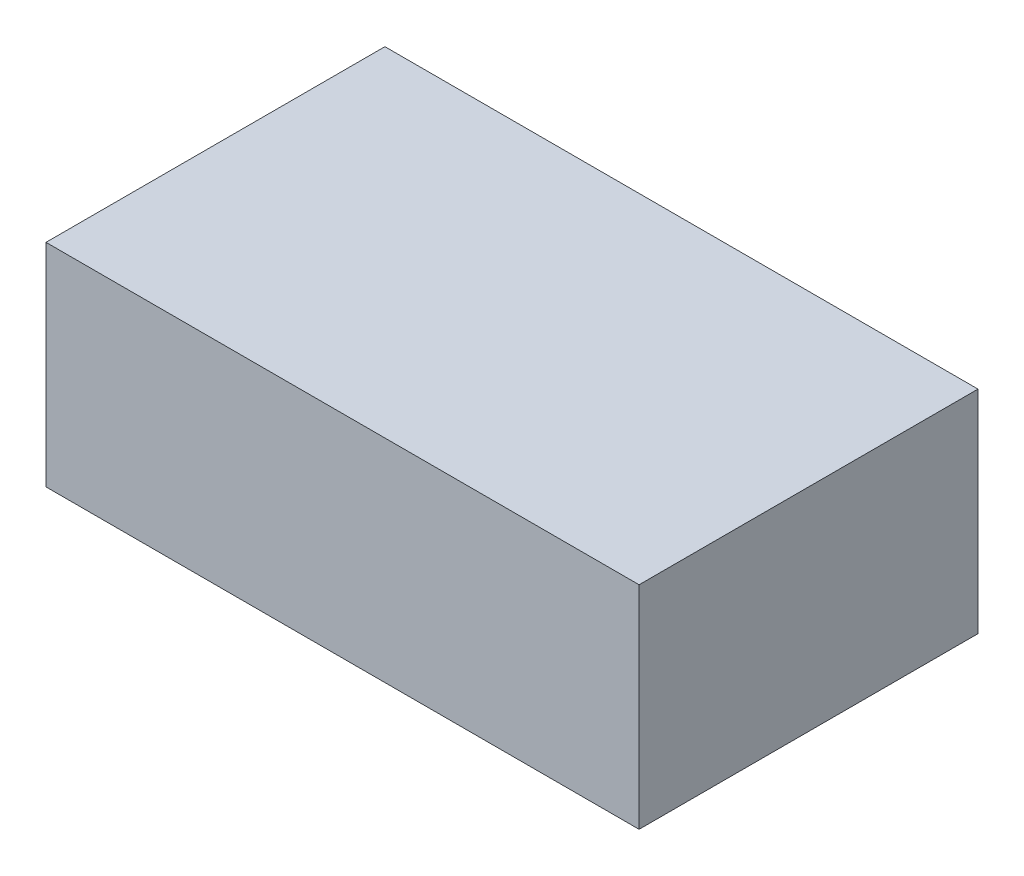
ISO-10303-21;
HEADER;
FILE_DESCRIPTION(('STEP AP214'),'2;1');
FILE_NAME('part.step','',(''),(''),'','','');
FILE_SCHEMA(('AUTOMOTIVE_DESIGN { 1 0 10303 214 1 1 1 1 }'));
ENDSEC;
DATA;
#1=APPLICATION_CONTEXT('core data for automotive mechanical design processes');
#2=APPLICATION_PROTOCOL_DEFINITION('international standard','automotive_design',2000,#1);
#3=PRODUCT_CONTEXT('',#1,'mechanical');
#4=PRODUCT('Part','Part','',(#3));
#5=PRODUCT_RELATED_PRODUCT_CATEGORY('part','',(#4));
#6=PRODUCT_DEFINITION_FORMATION('','',#4);
#7=PRODUCT_DEFINITION_CONTEXT('part definition',#1,'design');
#8=PRODUCT_DEFINITION('design','',#6,#7);
#9=PRODUCT_DEFINITION_SHAPE('','',#8);
#10=(LENGTH_UNIT() NAMED_UNIT(*) SI_UNIT(.MILLI.,.METRE.));
#11=(NAMED_UNIT(*) PLANE_ANGLE_UNIT() SI_UNIT($,.RADIAN.));
#12=(NAMED_UNIT(*) SI_UNIT($,.STERADIAN.) SOLID_ANGLE_UNIT());
#13=UNCERTAINTY_MEASURE_WITH_UNIT(LENGTH_MEASURE(1.E-05),#10,'distance_accuracy_value','');
#14=(GEOMETRIC_REPRESENTATION_CONTEXT(3) GLOBAL_UNCERTAINTY_ASSIGNED_CONTEXT((#13)) GLOBAL_UNIT_ASSIGNED_CONTEXT((#10,
#11,#12)) REPRESENTATION_CONTEXT('',''));
#15=CARTESIAN_POINT('',(0.,0.,0.));
#16=DIRECTION('',(0.,0.,1.));
#17=DIRECTION('',(1.,0.,0.));
#18=AXIS2_PLACEMENT_3D('',#15,#16,#17);
#19=CARTESIAN_POINT('',(-99.93265993266,30.8922558922559,80.));
#20=DIRECTION('',(1.,0.,0.));
#21=DIRECTION('',(0.,0.,-1.));
#22=AXIS2_PLACEMENT_3D('',#19,#20,#21);
#23=PLANE('',#22);
#24=DIRECTION('',(0.,-1.,0.));
#25=VECTOR('',#24,1.);
#26=CARTESIAN_POINT('',(-99.93265993266,30.8922558922559,0.));
#27=LINE('',#26,#25);
#28=CARTESIAN_POINT('',(-99.93265993266,30.8922558922559,0.));
#29=VERTEX_POINT('',#28);
#30=CARTESIAN_POINT('',(-99.93265993266,-19.1077441077441,0.));
#31=VERTEX_POINT('',#30);
#32=EDGE_CURVE('E241',#29,#31,#27,.T.);
#33=ORIENTED_EDGE('',*,*,#32,.T.);
#34=DIRECTION('',(0.,0.,-1.));
#35=VECTOR('',#34,1.);
#36=CARTESIAN_POINT('',(-99.93265993266,-19.1077441077441,80.));
#37=LINE('',#36,#35);
#38=CARTESIAN_POINT('',(-99.93265993266,-19.1077441077441,80.));
#39=VERTEX_POINT('',#38);
#40=EDGE_CURVE('E11',#39,#31,#37,.T.);
#41=ORIENTED_EDGE('',*,*,#40,.F.);
#42=DIRECTION('',(0.,-1.,0.));
#43=VECTOR('',#42,1.);
#44=CARTESIAN_POINT('',(-99.93265993266,30.8922558922559,80.));
#45=LINE('',#44,#43);
#46=CARTESIAN_POINT('',(-99.93265993266,30.8922558922559,80.));
#47=VERTEX_POINT('',#46);
#48=EDGE_CURVE('E248',#47,#39,#45,.T.);
#49=ORIENTED_EDGE('',*,*,#48,.F.);
#50=DIRECTION('',(0.,0.,-1.));
#51=VECTOR('',#50,1.);
#52=CARTESIAN_POINT('',(-99.93265993266,30.8922558922559,80.));
#53=LINE('',#52,#51);
#54=EDGE_CURVE('E260',#47,#29,#53,.T.);
#55=ORIENTED_EDGE('',*,*,#54,.T.);
#56=EDGE_LOOP('',(#33,#41,#49,#55));
#57=FACE_BOUND('',#56,.T.);
#58=ADVANCED_FACE('F35',(#57),#23,.F.);
#59=CARTESIAN_POINT('',(-99.93265993266,-19.1077441077441,80.));
#60=DIRECTION('',(0.,1.,0.));
#61=DIRECTION('',(-1.,0.,0.));
#62=AXIS2_PLACEMENT_3D('',#59,#60,#61);
#63=PLANE('',#62);
#64=DIRECTION('',(1.,0.,0.));
#65=VECTOR('',#64,1.);
#66=CARTESIAN_POINT('',(-99.93265993266,-19.1077441077441,0.));
#67=LINE('',#66,#65);
#68=CARTESIAN_POINT('',(40.0673400673401,-19.1077441077441,0.));
#69=VERTEX_POINT('',#68);
#70=EDGE_CURVE('E263',#31,#69,#67,.T.);
#71=ORIENTED_EDGE('',*,*,#70,.T.);
#72=DIRECTION('',(0.,0.,-1.));
#73=VECTOR('',#72,1.);
#74=CARTESIAN_POINT('',(40.0673400673401,-19.1077441077441,80.));
#75=LINE('',#74,#73);
#76=CARTESIAN_POINT('',(40.0673400673401,-19.1077441077441,80.));
#77=VERTEX_POINT('',#76);
#78=EDGE_CURVE('E42',#77,#69,#75,.T.);
#79=ORIENTED_EDGE('',*,*,#78,.F.);
#80=DIRECTION('',(1.,0.,0.));
#81=VECTOR('',#80,1.);
#82=CARTESIAN_POINT('',(-99.93265993266,-19.1077441077441,80.));
#83=LINE('',#82,#81);
#84=EDGE_CURVE('E251',#39,#77,#83,.T.);
#85=ORIENTED_EDGE('',*,*,#84,.F.);
#86=ORIENTED_EDGE('',*,*,#40,.T.);
#87=EDGE_LOOP('',(#71,#79,#85,#86));
#88=FACE_BOUND('',#87,.T.);
#89=ADVANCED_FACE('F279',(#88),#63,.F.);
#90=CARTESIAN_POINT('',(40.0673400673401,30.8922558922559,80.));
#91=DIRECTION('',(1.,0.,0.));
#92=DIRECTION('',(0.,0.,-1.));
#93=AXIS2_PLACEMENT_3D('',#90,#91,#92);
#94=PLANE('',#93);
#95=DIRECTION('',(0.,-1.,0.));
#96=VECTOR('',#95,1.);
#97=CARTESIAN_POINT('',(40.0673400673401,30.8922558922559,0.));
#98=LINE('',#97,#96);
#99=CARTESIAN_POINT('',(40.0673400673401,30.8922558922559,0.));
#100=VERTEX_POINT('',#99);
#101=EDGE_CURVE('E266',#100,#69,#98,.T.);
#102=ORIENTED_EDGE('',*,*,#101,.F.);
#103=DIRECTION('',(0.,0.,-1.));
#104=VECTOR('',#103,1.);
#105=CARTESIAN_POINT('',(40.0673400673401,30.8922558922559,80.));
#106=LINE('',#105,#104);
#107=CARTESIAN_POINT('',(40.0673400673401,30.8922558922559,80.));
#108=VERTEX_POINT('',#107);
#109=EDGE_CURVE('E272',#108,#100,#106,.T.);
#110=ORIENTED_EDGE('',*,*,#109,.F.);
#111=DIRECTION('',(0.,-1.,0.));
#112=VECTOR('',#111,1.);
#113=CARTESIAN_POINT('',(40.0673400673401,30.8922558922559,80.));
#114=LINE('',#113,#112);
#115=EDGE_CURVE('E254',#108,#77,#114,.T.);
#116=ORIENTED_EDGE('',*,*,#115,.T.);
#117=ORIENTED_EDGE('',*,*,#78,.T.);
#118=EDGE_LOOP('',(#102,#110,#116,#117));
#119=FACE_BOUND('',#118,.T.);
#120=ADVANCED_FACE('F276',(#119),#94,.T.);
#121=CARTESIAN_POINT('',(-99.93265993266,30.8922558922559,80.));
#122=DIRECTION('',(0.,1.,0.));
#123=DIRECTION('',(0.,0.,1.));
#124=AXIS2_PLACEMENT_3D('',#121,#122,#123);
#125=PLANE('',#124);
#126=DIRECTION('',(1.,0.,0.));
#127=VECTOR('',#126,1.);
#128=CARTESIAN_POINT('',(-99.93265993266,30.8922558922559,0.));
#129=LINE('',#128,#127);
#130=EDGE_CURVE('E252',#29,#100,#129,.T.);
#131=ORIENTED_EDGE('',*,*,#130,.F.);
#132=ORIENTED_EDGE('',*,*,#54,.F.);
#133=DIRECTION('',(1.,0.,0.));
#134=VECTOR('',#133,1.);
#135=CARTESIAN_POINT('',(-99.93265993266,30.8922558922559,80.));
#136=LINE('',#135,#134);
#137=EDGE_CURVE('E257',#47,#108,#136,.T.);
#138=ORIENTED_EDGE('',*,*,#137,.T.);
#139=ORIENTED_EDGE('',*,*,#109,.T.);
#140=EDGE_LOOP('',(#131,#132,#138,#139));
#141=FACE_BOUND('',#140,.T.);
#142=ADVANCED_FACE('F286',(#141),#125,.T.);
#143=CARTESIAN_POINT('',(0.,0.,80.));
#144=DIRECTION('',(0.,0.,1.));
#145=DIRECTION('',(1.,0.,0.));
#146=AXIS2_PLACEMENT_3D('',#143,#144,#145);
#147=PLANE('',#146);
#148=ORIENTED_EDGE('',*,*,#48,.T.);
#149=ORIENTED_EDGE('',*,*,#84,.T.);
#150=ORIENTED_EDGE('',*,*,#115,.F.);
#151=ORIENTED_EDGE('',*,*,#137,.F.);
#152=EDGE_LOOP('',(#148,#149,#150,#151));
#153=FACE_BOUND('',#152,.T.);
#154=ADVANCED_FACE('F290',(#153),#147,.T.);
#155=CARTESIAN_POINT('',(0.,0.,0.));
#156=DIRECTION('',(0.,0.,1.));
#157=DIRECTION('',(1.,0.,0.));
#158=AXIS2_PLACEMENT_3D('',#155,#156,#157);
#159=PLANE('',#158);
#160=DIRECTION('',(-1.,0.,0.));
#161=VECTOR('',#160,1.);
#162=CARTESIAN_POINT('',(35.06734006734,-14.1077441077441,0.));
#163=LINE('',#162,#161);
#164=CARTESIAN_POINT('',(35.06734006734,-14.1077441077441,0.));
#165=VERTEX_POINT('',#164);
#166=CARTESIAN_POINT('',(-4.93265993265996,-14.1077441077441,0.));
#167=VERTEX_POINT('',#166);
#168=EDGE_CURVE('E176',#165,#167,#163,.T.);
#169=ORIENTED_EDGE('',*,*,#168,.F.);
#170=DIRECTION('',(0.,-1.,0.));
#171=VECTOR('',#170,1.);
#172=CARTESIAN_POINT('',(35.06734006734,25.8922558922559,0.));
#173=LINE('',#172,#171);
#174=CARTESIAN_POINT('',(35.06734006734,25.8922558922559,0.));
#175=VERTEX_POINT('',#174);
#176=EDGE_CURVE('E49',#175,#165,#173,.T.);
#177=ORIENTED_EDGE('',*,*,#176,.F.);
#178=DIRECTION('',(1.,0.,0.));
#179=VECTOR('',#178,1.);
#180=CARTESIAN_POINT('',(35.06734006734,25.8922558922559,0.));
#181=LINE('',#180,#179);
#182=CARTESIAN_POINT('',(-4.93265993265996,25.8922558922559,0.));
#183=VERTEX_POINT('',#182);
#184=EDGE_CURVE('E167',#183,#175,#181,.T.);
#185=ORIENTED_EDGE('',*,*,#184,.F.);
#186=DIRECTION('',(0.,1.,0.));
#187=VECTOR('',#186,1.);
#188=CARTESIAN_POINT('',(-4.93265993265996,25.8922558922559,0.));
#189=LINE('',#188,#187);
#190=EDGE_CURVE('E170',#167,#183,#189,.T.);
#191=ORIENTED_EDGE('',*,*,#190,.F.);
#192=EDGE_LOOP('',(#169,#177,#185,#191));
#193=FACE_BOUND('',#192,.T.);
#194=DIRECTION('',(-1.,0.,0.));
#195=VECTOR('',#194,1.);
#196=CARTESIAN_POINT('',(-54.93265993266,-14.1077441077441,0.));
#197=LINE('',#196,#195);
#198=CARTESIAN_POINT('',(-54.93265993266,-14.1077441077441,0.));
#199=VERTEX_POINT('',#198);
#200=CARTESIAN_POINT('',(-94.9326599326599,-14.1077441077441,0.));
#201=VERTEX_POINT('',#200);
#202=EDGE_CURVE('E202',#199,#201,#197,.T.);
#203=ORIENTED_EDGE('',*,*,#202,.F.);
#204=DIRECTION('',(0.,-1.,0.));
#205=VECTOR('',#204,1.);
#206=CARTESIAN_POINT('',(-54.93265993266,25.8922558922559,0.));
#207=LINE('',#206,#205);
#208=CARTESIAN_POINT('',(-54.93265993266,25.8922558922559,0.));
#209=VERTEX_POINT('',#208);
#210=EDGE_CURVE('E57',#209,#199,#207,.T.);
#211=ORIENTED_EDGE('',*,*,#210,.F.);
#212=DIRECTION('',(1.,0.,0.));
#213=VECTOR('',#212,1.);
#214=CARTESIAN_POINT('',(-54.93265993266,25.8922558922559,0.));
#215=LINE('',#214,#213);
#216=CARTESIAN_POINT('',(-94.9326599326599,25.8922558922559,0.));
#217=VERTEX_POINT('',#216);
#218=EDGE_CURVE('E191',#217,#209,#215,.T.);
#219=ORIENTED_EDGE('',*,*,#218,.F.);
#220=DIRECTION('',(0.,1.,0.));
#221=VECTOR('',#220,1.);
#222=CARTESIAN_POINT('',(-94.9326599326599,25.8922558922559,0.));
#223=LINE('',#222,#221);
#224=EDGE_CURVE('E205',#201,#217,#223,.T.);
#225=ORIENTED_EDGE('',*,*,#224,.F.);
#226=EDGE_LOOP('',(#203,#211,#219,#225));
#227=FACE_BOUND('',#226,.T.);
#228=DIRECTION('',(-1.,0.,0.));
#229=VECTOR('',#228,1.);
#230=CARTESIAN_POINT('',(-9.93265993265996,-14.1077441077441,0.));
#231=LINE('',#230,#229);
#232=CARTESIAN_POINT('',(-9.93265993265996,-14.1077441077441,0.));
#233=VERTEX_POINT('',#232);
#234=CARTESIAN_POINT('',(-49.93265993266,-14.1077441077441,0.));
#235=VERTEX_POINT('',#234);
#236=EDGE_CURVE('E231',#233,#235,#231,.T.);
#237=ORIENTED_EDGE('',*,*,#236,.F.);
#238=DIRECTION('',(0.,-1.,0.));
#239=VECTOR('',#238,1.);
#240=CARTESIAN_POINT('',(-9.93265993265995,25.8922558922559,0.));
#241=LINE('',#240,#239);
#242=CARTESIAN_POINT('',(-9.93265993265995,25.8922558922559,0.));
#243=VERTEX_POINT('',#242);
#244=EDGE_CURVE('E183',#243,#233,#241,.T.);
#245=ORIENTED_EDGE('',*,*,#244,.F.);
#246=DIRECTION('',(1.,0.,0.));
#247=VECTOR('',#246,1.);
#248=CARTESIAN_POINT('',(-9.93265993265995,25.8922558922559,0.));
#249=LINE('',#248,#247);
#250=CARTESIAN_POINT('',(-49.93265993266,25.8922558922559,0.));
#251=VERTEX_POINT('',#250);
#252=EDGE_CURVE('E220',#251,#243,#249,.T.);
#253=ORIENTED_EDGE('',*,*,#252,.F.);
#254=DIRECTION('',(0.,1.,0.));
#255=VECTOR('',#254,1.);
#256=CARTESIAN_POINT('',(-49.93265993266,25.8922558922559,0.));
#257=LINE('',#256,#255);
#258=EDGE_CURVE('E234',#235,#251,#257,.T.);
#259=ORIENTED_EDGE('',*,*,#258,.F.);
#260=EDGE_LOOP('',(#237,#245,#253,#259));
#261=FACE_BOUND('',#260,.T.);
#262=ORIENTED_EDGE('',*,*,#32,.F.);
#263=ORIENTED_EDGE('',*,*,#130,.T.);
#264=ORIENTED_EDGE('',*,*,#101,.T.);
#265=ORIENTED_EDGE('',*,*,#70,.F.);
#266=EDGE_LOOP('',(#262,#263,#264,#265));
#267=FACE_BOUND('',#266,.T.);
#268=ADVANCED_FACE('F283',(#193,#227,#261,#267),#159,.F.);
#269=CARTESIAN_POINT('',(-9.93265993265995,25.8922558922559,75.));
#270=DIRECTION('',(1.,0.,0.));
#271=DIRECTION('',(0.,1.,0.));
#272=AXIS2_PLACEMENT_3D('',#269,#270,#271);
#273=PLANE('',#272);
#274=ORIENTED_EDGE('',*,*,#244,.T.);
#275=DIRECTION('',(0.,0.,-1.));
#276=VECTOR('',#275,1.);
#277=CARTESIAN_POINT('',(-9.93265993265996,-14.1077441077441,75.));
#278=LINE('',#277,#276);
#279=CARTESIAN_POINT('',(-9.93265993265996,-14.1077441077441,75.));
#280=VERTEX_POINT('',#279);
#281=EDGE_CURVE('E229',#280,#233,#278,.T.);
#282=ORIENTED_EDGE('',*,*,#281,.F.);
#283=DIRECTION('',(0.,-1.,0.));
#284=VECTOR('',#283,1.);
#285=CARTESIAN_POINT('',(-9.93265993265995,25.8922558922559,75.));
#286=LINE('',#285,#284);
#287=CARTESIAN_POINT('',(-9.93265993265995,25.8922558922559,75.));
#288=VERTEX_POINT('',#287);
#289=EDGE_CURVE('E216',#288,#280,#286,.T.);
#290=ORIENTED_EDGE('',*,*,#289,.F.);
#291=DIRECTION('',(0.,0.,-1.));
#292=VECTOR('',#291,1.);
#293=CARTESIAN_POINT('',(-9.93265993265995,25.8922558922559,75.));
#294=LINE('',#293,#292);
#295=EDGE_CURVE('E239',#288,#243,#294,.T.);
#296=ORIENTED_EDGE('',*,*,#295,.T.);
#297=EDGE_LOOP('',(#274,#282,#290,#296));
#298=FACE_BOUND('',#297,.T.);
#299=ADVANCED_FACE('F305',(#298),#273,.F.);
#300=CARTESIAN_POINT('',(-9.93265993265995,25.8922558922559,75.));
#301=DIRECTION('',(0.,1.,0.));
#302=DIRECTION('',(0.,0.,1.));
#303=AXIS2_PLACEMENT_3D('',#300,#301,#302);
#304=PLANE('',#303);
#305=ORIENTED_EDGE('',*,*,#252,.T.);
#306=ORIENTED_EDGE('',*,*,#295,.F.);
#307=DIRECTION('',(1.,0.,0.));
#308=VECTOR('',#307,1.);
#309=CARTESIAN_POINT('',(-9.93265993265995,25.8922558922559,75.));
#310=LINE('',#309,#308);
#311=CARTESIAN_POINT('',(-49.93265993266,25.8922558922559,75.));
#312=VERTEX_POINT('',#311);
#313=EDGE_CURVE('E226',#312,#288,#310,.T.);
#314=ORIENTED_EDGE('',*,*,#313,.F.);
#315=DIRECTION('',(0.,0.,-1.));
#316=VECTOR('',#315,1.);
#317=CARTESIAN_POINT('',(-49.93265993266,25.8922558922559,75.));
#318=LINE('',#317,#316);
#319=EDGE_CURVE('E242',#312,#251,#318,.T.);
#320=ORIENTED_EDGE('',*,*,#319,.T.);
#321=EDGE_LOOP('',(#305,#306,#314,#320));
#322=FACE_BOUND('',#321,.T.);
#323=ADVANCED_FACE('F311',(#322),#304,.F.);
#324=CARTESIAN_POINT('',(-49.93265993266,25.8922558922559,75.));
#325=DIRECTION('',(-1.,0.,0.));
#326=DIRECTION('',(0.,-1.,0.));
#327=AXIS2_PLACEMENT_3D('',#324,#325,#326);
#328=PLANE('',#327);
#329=ORIENTED_EDGE('',*,*,#258,.T.);
#330=ORIENTED_EDGE('',*,*,#319,.F.);
#331=DIRECTION('',(0.,1.,0.));
#332=VECTOR('',#331,1.);
#333=CARTESIAN_POINT('',(-49.93265993266,25.8922558922559,75.));
#334=LINE('',#333,#332);
#335=CARTESIAN_POINT('',(-49.93265993266,-14.1077441077441,75.));
#336=VERTEX_POINT('',#335);
#337=EDGE_CURVE('E223',#336,#312,#334,.T.);
#338=ORIENTED_EDGE('',*,*,#337,.F.);
#339=DIRECTION('',(0.,0.,-1.));
#340=VECTOR('',#339,1.);
#341=CARTESIAN_POINT('',(-49.93265993266,-14.1077441077441,75.));
#342=LINE('',#341,#340);
#343=EDGE_CURVE('E244',#336,#235,#342,.T.);
#344=ORIENTED_EDGE('',*,*,#343,.T.);
#345=EDGE_LOOP('',(#329,#330,#338,#344));
#346=FACE_BOUND('',#345,.T.);
#347=ADVANCED_FACE('F317',(#346),#328,.F.);
#348=CARTESIAN_POINT('',(-9.93265993265996,-14.1077441077441,75.));
#349=DIRECTION('',(0.,-1.,0.));
#350=DIRECTION('',(0.,0.,-1.));
#351=AXIS2_PLACEMENT_3D('',#348,#349,#350);
#352=PLANE('',#351);
#353=ORIENTED_EDGE('',*,*,#236,.T.);
#354=ORIENTED_EDGE('',*,*,#343,.F.);
#355=DIRECTION('',(-1.,0.,0.));
#356=VECTOR('',#355,1.);
#357=CARTESIAN_POINT('',(-9.93265993265996,-14.1077441077441,75.));
#358=LINE('',#357,#356);
#359=EDGE_CURVE('E219',#280,#336,#358,.T.);
#360=ORIENTED_EDGE('',*,*,#359,.F.);
#361=ORIENTED_EDGE('',*,*,#281,.T.);
#362=EDGE_LOOP('',(#353,#354,#360,#361));
#363=FACE_BOUND('',#362,.T.);
#364=ADVANCED_FACE('F313',(#363),#352,.F.);
#365=CARTESIAN_POINT('',(0.,0.,75.));
#366=DIRECTION('',(0.,0.,-1.));
#367=DIRECTION('',(-1.,0.,0.));
#368=AXIS2_PLACEMENT_3D('',#365,#366,#367);
#369=PLANE('',#368);
#370=ORIENTED_EDGE('',*,*,#289,.T.);
#371=ORIENTED_EDGE('',*,*,#359,.T.);
#372=ORIENTED_EDGE('',*,*,#337,.T.);
#373=ORIENTED_EDGE('',*,*,#313,.T.);
#374=EDGE_LOOP('',(#370,#371,#372,#373));
#375=FACE_BOUND('',#374,.T.);
#376=ADVANCED_FACE('F316',(#375),#369,.T.);
#377=CARTESIAN_POINT('',(-54.93265993266,25.8922558922559,75.));
#378=DIRECTION('',(1.,0.,0.));
#379=DIRECTION('',(0.,1.,0.));
#380=AXIS2_PLACEMENT_3D('',#377,#378,#379);
#381=PLANE('',#380);
#382=ORIENTED_EDGE('',*,*,#210,.T.);
#383=DIRECTION('',(0.,0.,-1.));
#384=VECTOR('',#383,1.);
#385=CARTESIAN_POINT('',(-54.93265993266,-14.1077441077441,75.));
#386=LINE('',#385,#384);
#387=CARTESIAN_POINT('',(-54.93265993266,-14.1077441077441,75.));
#388=VERTEX_POINT('',#387);
#389=EDGE_CURVE('E200',#388,#199,#386,.T.);
#390=ORIENTED_EDGE('',*,*,#389,.F.);
#391=DIRECTION('',(0.,-1.,0.));
#392=VECTOR('',#391,1.);
#393=CARTESIAN_POINT('',(-54.93265993266,25.8922558922559,75.));
#394=LINE('',#393,#392);
#395=CARTESIAN_POINT('',(-54.93265993266,25.8922558922559,75.));
#396=VERTEX_POINT('',#395);
#397=EDGE_CURVE('E187',#396,#388,#394,.T.);
#398=ORIENTED_EDGE('',*,*,#397,.F.);
#399=DIRECTION('',(0.,0.,-1.));
#400=VECTOR('',#399,1.);
#401=CARTESIAN_POINT('',(-54.93265993266,25.8922558922559,75.));
#402=LINE('',#401,#400);
#403=EDGE_CURVE('E177',#396,#209,#402,.T.);
#404=ORIENTED_EDGE('',*,*,#403,.T.);
#405=EDGE_LOOP('',(#382,#390,#398,#404));
#406=FACE_BOUND('',#405,.T.);
#407=ADVANCED_FACE('F327',(#406),#381,.F.);
#408=CARTESIAN_POINT('',(-54.93265993266,25.8922558922559,75.));
#409=DIRECTION('',(0.,1.,0.));
#410=DIRECTION('',(0.,0.,1.));
#411=AXIS2_PLACEMENT_3D('',#408,#409,#410);
#412=PLANE('',#411);
#413=ORIENTED_EDGE('',*,*,#218,.T.);
#414=ORIENTED_EDGE('',*,*,#403,.F.);
#415=DIRECTION('',(1.,0.,0.));
#416=VECTOR('',#415,1.);
#417=CARTESIAN_POINT('',(-54.93265993266,25.8922558922559,75.));
#418=LINE('',#417,#416);
#419=CARTESIAN_POINT('',(-94.9326599326599,25.8922558922559,75.));
#420=VERTEX_POINT('',#419);
#421=EDGE_CURVE('E197',#420,#396,#418,.T.);
#422=ORIENTED_EDGE('',*,*,#421,.F.);
#423=DIRECTION('',(0.,0.,-1.));
#424=VECTOR('',#423,1.);
#425=CARTESIAN_POINT('',(-94.9326599326599,25.8922558922559,75.));
#426=LINE('',#425,#424);
#427=EDGE_CURVE('E211',#420,#217,#426,.T.);
#428=ORIENTED_EDGE('',*,*,#427,.T.);
#429=EDGE_LOOP('',(#413,#414,#422,#428));
#430=FACE_BOUND('',#429,.T.);
#431=ADVANCED_FACE('F331',(#430),#412,.F.);
#432=CARTESIAN_POINT('',(-94.9326599326599,25.8922558922559,75.));
#433=DIRECTION('',(-1.,0.,0.));
#434=DIRECTION('',(0.,0.,1.));
#435=AXIS2_PLACEMENT_3D('',#432,#433,#434);
#436=PLANE('',#435);
#437=ORIENTED_EDGE('',*,*,#224,.T.);
#438=ORIENTED_EDGE('',*,*,#427,.F.);
#439=DIRECTION('',(0.,1.,0.));
#440=VECTOR('',#439,1.);
#441=CARTESIAN_POINT('',(-94.9326599326599,25.8922558922559,75.));
#442=LINE('',#441,#440);
#443=CARTESIAN_POINT('',(-94.9326599326599,-14.1077441077441,75.));
#444=VERTEX_POINT('',#443);
#445=EDGE_CURVE('E194',#444,#420,#442,.T.);
#446=ORIENTED_EDGE('',*,*,#445,.F.);
#447=DIRECTION('',(0.,0.,-1.));
#448=VECTOR('',#447,1.);
#449=CARTESIAN_POINT('',(-94.9326599326599,-14.1077441077441,75.));
#450=LINE('',#449,#448);
#451=EDGE_CURVE('E213',#444,#201,#450,.T.);
#452=ORIENTED_EDGE('',*,*,#451,.T.);
#453=EDGE_LOOP('',(#437,#438,#446,#452));
#454=FACE_BOUND('',#453,.T.);
#455=ADVANCED_FACE('F336',(#454),#436,.F.);
#456=CARTESIAN_POINT('',(-54.93265993266,-14.1077441077441,75.));
#457=DIRECTION('',(0.,-1.,0.));
#458=DIRECTION('',(0.,0.,-1.));
#459=AXIS2_PLACEMENT_3D('',#456,#457,#458);
#460=PLANE('',#459);
#461=ORIENTED_EDGE('',*,*,#202,.T.);
#462=ORIENTED_EDGE('',*,*,#451,.F.);
#463=DIRECTION('',(-1.,0.,0.));
#464=VECTOR('',#463,1.);
#465=CARTESIAN_POINT('',(-54.93265993266,-14.1077441077441,75.));
#466=LINE('',#465,#464);
#467=EDGE_CURVE('E190',#388,#444,#466,.T.);
#468=ORIENTED_EDGE('',*,*,#467,.F.);
#469=ORIENTED_EDGE('',*,*,#389,.T.);
#470=EDGE_LOOP('',(#461,#462,#468,#469));
#471=FACE_BOUND('',#470,.T.);
#472=ADVANCED_FACE('F332',(#471),#460,.F.);
#473=CARTESIAN_POINT('',(0.,0.,75.));
#474=DIRECTION('',(0.,0.,-1.));
#475=DIRECTION('',(-1.,0.,0.));
#476=AXIS2_PLACEMENT_3D('',#473,#474,#475);
#477=PLANE('',#476);
#478=ORIENTED_EDGE('',*,*,#397,.T.);
#479=ORIENTED_EDGE('',*,*,#467,.T.);
#480=ORIENTED_EDGE('',*,*,#445,.T.);
#481=ORIENTED_EDGE('',*,*,#421,.T.);
#482=EDGE_LOOP('',(#478,#479,#480,#481));
#483=FACE_BOUND('',#482,.T.);
#484=ADVANCED_FACE('F335',(#483),#477,.T.);
#485=CARTESIAN_POINT('',(35.06734006734,25.8922558922559,75.));
#486=DIRECTION('',(1.,0.,0.));
#487=DIRECTION('',(0.,1.,0.));
#488=AXIS2_PLACEMENT_3D('',#485,#486,#487);
#489=PLANE('',#488);
#490=ORIENTED_EDGE('',*,*,#176,.T.);
#491=DIRECTION('',(0.,0.,-1.));
#492=VECTOR('',#491,1.);
#493=CARTESIAN_POINT('',(35.06734006734,-14.1077441077441,75.));
#494=LINE('',#493,#492);
#495=CARTESIAN_POINT('',(35.06734006734,-14.1077441077441,75.));
#496=VERTEX_POINT('',#495);
#497=EDGE_CURVE('E145',#496,#165,#494,.T.);
#498=ORIENTED_EDGE('',*,*,#497,.F.);
#499=DIRECTION('',(0.,-1.,0.));
#500=VECTOR('',#499,1.);
#501=CARTESIAN_POINT('',(35.06734006734,25.8922558922559,75.));
#502=LINE('',#501,#500);
#503=CARTESIAN_POINT('',(35.06734006734,25.8922558922559,75.));
#504=VERTEX_POINT('',#503);
#505=EDGE_CURVE('E149',#504,#496,#502,.T.);
#506=ORIENTED_EDGE('',*,*,#505,.F.);
#507=DIRECTION('',(0.,0.,-1.));
#508=VECTOR('',#507,1.);
#509=CARTESIAN_POINT('',(35.06734006734,25.8922558922559,75.));
#510=LINE('',#509,#508);
#511=EDGE_CURVE('E181',#504,#175,#510,.T.);
#512=ORIENTED_EDGE('',*,*,#511,.T.);
#513=EDGE_LOOP('',(#490,#498,#506,#512));
#514=FACE_BOUND('',#513,.T.);
#515=ADVANCED_FACE('F147',(#514),#489,.F.);
#516=CARTESIAN_POINT('',(35.06734006734,25.8922558922559,75.));
#517=DIRECTION('',(0.,1.,0.));
#518=DIRECTION('',(0.,0.,1.));
#519=AXIS2_PLACEMENT_3D('',#516,#517,#518);
#520=PLANE('',#519);
#521=ORIENTED_EDGE('',*,*,#184,.T.);
#522=ORIENTED_EDGE('',*,*,#511,.F.);
#523=DIRECTION('',(1.,0.,0.));
#524=VECTOR('',#523,1.);
#525=CARTESIAN_POINT('',(35.06734006734,25.8922558922559,75.));
#526=LINE('',#525,#524);
#527=CARTESIAN_POINT('',(-4.93265993265996,25.8922558922559,75.));
#528=VERTEX_POINT('',#527);
#529=EDGE_CURVE('E155',#528,#504,#526,.T.);
#530=ORIENTED_EDGE('',*,*,#529,.F.);
#531=DIRECTION('',(0.,0.,-1.));
#532=VECTOR('',#531,1.);
#533=CARTESIAN_POINT('',(-4.93265993265996,25.8922558922559,75.));
#534=LINE('',#533,#532);
#535=EDGE_CURVE('E184',#528,#183,#534,.T.);
#536=ORIENTED_EDGE('',*,*,#535,.T.);
#537=EDGE_LOOP('',(#521,#522,#530,#536));
#538=FACE_BOUND('',#537,.T.);
#539=ADVANCED_FACE('F349',(#538),#520,.F.);
#540=CARTESIAN_POINT('',(-4.93265993265996,25.8922558922559,75.));
#541=DIRECTION('',(-1.,0.,0.));
#542=DIRECTION('',(0.,-1.,0.));
#543=AXIS2_PLACEMENT_3D('',#540,#541,#542);
#544=PLANE('',#543);
#545=ORIENTED_EDGE('',*,*,#190,.T.);
#546=ORIENTED_EDGE('',*,*,#535,.F.);
#547=DIRECTION('',(0.,1.,0.));
#548=VECTOR('',#547,1.);
#549=CARTESIAN_POINT('',(-4.93265993265996,25.8922558922559,75.));
#550=LINE('',#549,#548);
#551=CARTESIAN_POINT('',(-4.93265993265996,-14.1077441077441,75.));
#552=VERTEX_POINT('',#551);
#553=EDGE_CURVE('E163',#552,#528,#550,.T.);
#554=ORIENTED_EDGE('',*,*,#553,.F.);
#555=DIRECTION('',(0.,0.,-1.));
#556=VECTOR('',#555,1.);
#557=CARTESIAN_POINT('',(-4.93265993265996,-14.1077441077441,75.));
#558=LINE('',#557,#556);
#559=EDGE_CURVE('E154',#552,#167,#558,.T.);
#560=ORIENTED_EDGE('',*,*,#559,.T.);
#561=EDGE_LOOP('',(#545,#546,#554,#560));
#562=FACE_BOUND('',#561,.T.);
#563=ADVANCED_FACE('F352',(#562),#544,.F.);
#564=CARTESIAN_POINT('',(35.06734006734,-14.1077441077441,75.));
#565=DIRECTION('',(0.,-1.,0.));
#566=DIRECTION('',(0.,0.,-1.));
#567=AXIS2_PLACEMENT_3D('',#564,#565,#566);
#568=PLANE('',#567);
#569=ORIENTED_EDGE('',*,*,#168,.T.);
#570=ORIENTED_EDGE('',*,*,#559,.F.);
#571=DIRECTION('',(-1.,0.,0.));
#572=VECTOR('',#571,1.);
#573=CARTESIAN_POINT('',(35.06734006734,-14.1077441077441,75.));
#574=LINE('',#573,#572);
#575=EDGE_CURVE('E158',#496,#552,#574,.T.);
#576=ORIENTED_EDGE('',*,*,#575,.F.);
#577=ORIENTED_EDGE('',*,*,#497,.T.);
#578=EDGE_LOOP('',(#569,#570,#576,#577));
#579=FACE_BOUND('',#578,.T.);
#580=ADVANCED_FACE('F159',(#579),#568,.F.);
#581=CARTESIAN_POINT('',(0.,0.,75.));
#582=DIRECTION('',(0.,0.,-1.));
#583=DIRECTION('',(-1.,0.,0.));
#584=AXIS2_PLACEMENT_3D('',#581,#582,#583);
#585=PLANE('',#584);
#586=ORIENTED_EDGE('',*,*,#505,.T.);
#587=ORIENTED_EDGE('',*,*,#575,.T.);
#588=ORIENTED_EDGE('',*,*,#553,.T.);
#589=ORIENTED_EDGE('',*,*,#529,.T.);
#590=EDGE_LOOP('',(#586,#587,#588,#589));
#591=FACE_BOUND('',#590,.T.);
#592=ADVANCED_FACE('F165',(#591),#585,.T.);
#593=CLOSED_SHELL('',(#58,#89,#120,#142,#154,#268,#299,#323,#347,#364,#376,#407,#431,#455,#472,
#484,#515,#539,#563,#580,#592));
#594=MANIFOLD_SOLID_BREP('B2',#593);
#595=ADVANCED_BREP_SHAPE_REPRESENTATION('',(#18,#594),#14);
#596=SHAPE_DEFINITION_REPRESENTATION(#9,#595);
ENDSEC;
END-ISO-10303-21;
